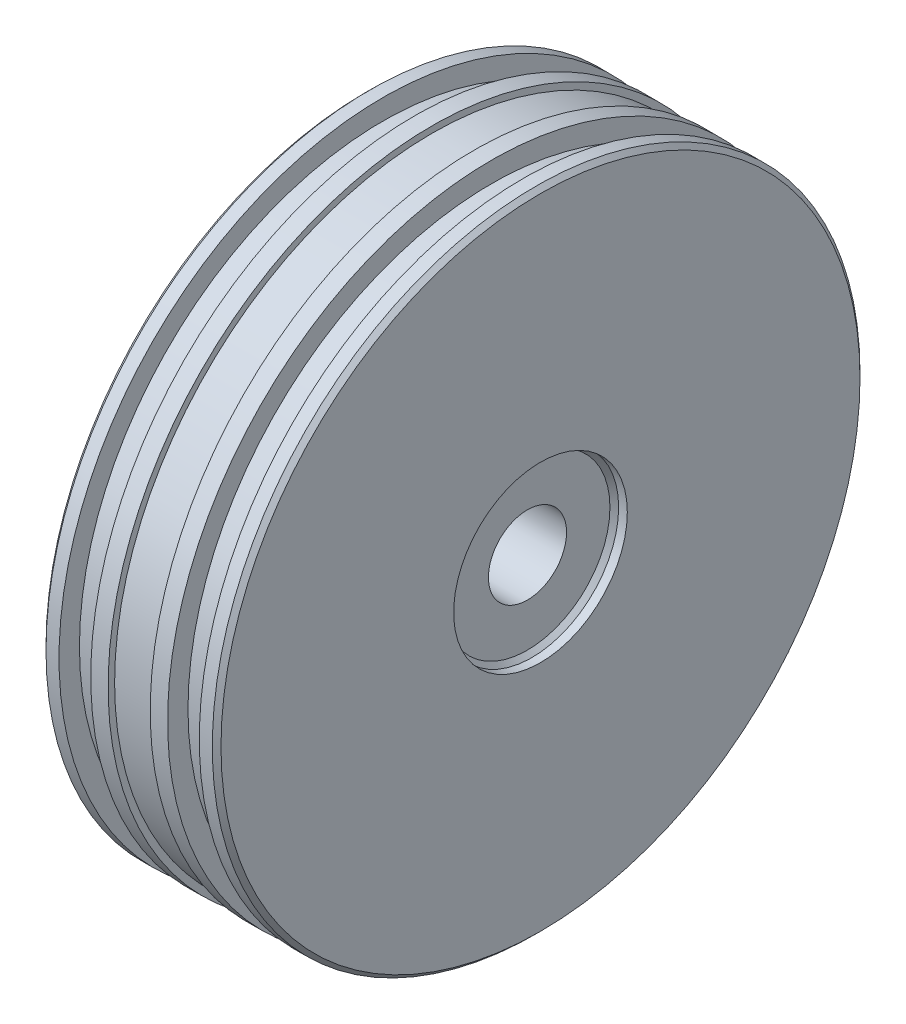
ISO-10303-21;
HEADER;
FILE_DESCRIPTION(('STEP AP214'),'2;1');
FILE_NAME('part.step','',(''),(''),'','','');
FILE_SCHEMA(('AUTOMOTIVE_DESIGN { 1 0 10303 214 1 1 1 1 }'));
ENDSEC;
DATA;
#1=APPLICATION_CONTEXT('core data for automotive mechanical design processes');
#2=APPLICATION_PROTOCOL_DEFINITION('international standard','automotive_design',2000,#1);
#3=PRODUCT_CONTEXT('',#1,'mechanical');
#4=PRODUCT('Part','Part','',(#3));
#5=PRODUCT_RELATED_PRODUCT_CATEGORY('part','',(#4));
#6=PRODUCT_DEFINITION_FORMATION('','',#4);
#7=PRODUCT_DEFINITION_CONTEXT('part definition',#1,'design');
#8=PRODUCT_DEFINITION('design','',#6,#7);
#9=PRODUCT_DEFINITION_SHAPE('','',#8);
#10=(LENGTH_UNIT() NAMED_UNIT(*) SI_UNIT(.MILLI.,.METRE.));
#11=(NAMED_UNIT(*) PLANE_ANGLE_UNIT() SI_UNIT($,.RADIAN.));
#12=(NAMED_UNIT(*) SI_UNIT($,.STERADIAN.) SOLID_ANGLE_UNIT());
#13=UNCERTAINTY_MEASURE_WITH_UNIT(LENGTH_MEASURE(1.E-05),#10,'distance_accuracy_value','');
#14=(GEOMETRIC_REPRESENTATION_CONTEXT(3) GLOBAL_UNCERTAINTY_ASSIGNED_CONTEXT((#13)) GLOBAL_UNIT_ASSIGNED_CONTEXT((#10,
#11,#12)) REPRESENTATION_CONTEXT('',''));
#15=CARTESIAN_POINT('',(0.,0.,0.));
#16=DIRECTION('',(0.,0.,1.));
#17=DIRECTION('',(1.,0.,0.));
#18=AXIS2_PLACEMENT_3D('',#15,#16,#17);
#19=CARTESIAN_POINT('',(0.,0.,0.));
#20=DIRECTION('',(1.,0.,0.));
#21=DIRECTION('',(0.,0.,-1.));
#22=AXIS2_PLACEMENT_3D('',#19,#20,#21);
#23=CYLINDRICAL_SURFACE('',#22,74.59);
#24=CARTESIAN_POINT('',(1.00000000000001,0.,0.));
#25=DIRECTION('',(-1.,0.,0.));
#26=DIRECTION('',(0.,0.,1.));
#27=AXIS2_PLACEMENT_3D('',#24,#25,#26);
#28=CIRCLE('',#27,74.59);
#29=CARTESIAN_POINT('',(1.00000000000001,0.,74.59));
#30=VERTEX_POINT('',#29);
#31=EDGE_CURVE('E250',#30,#30,#28,.F.);
#32=ORIENTED_EDGE('',*,*,#31,.T.);
#33=EDGE_LOOP('',(#32));
#34=FACE_BOUND('',#33,.T.);
#35=CARTESIAN_POINT('',(4.,0.,0.));
#36=DIRECTION('',(1.,0.,0.));
#37=DIRECTION('',(0.,0.,-1.));
#38=AXIS2_PLACEMENT_3D('',#35,#36,#37);
#39=CIRCLE('',#38,74.59);
#40=CARTESIAN_POINT('',(4.,0.,-74.59));
#41=VERTEX_POINT('',#40);
#42=EDGE_CURVE('E339',#41,#41,#39,.T.);
#43=ORIENTED_EDGE('',*,*,#42,.F.);
#44=EDGE_LOOP('',(#43));
#45=FACE_BOUND('',#44,.T.);
#46=ADVANCED_FACE('F43',(#34,#45),#23,.T.);
#47=CARTESIAN_POINT('',(0.,20.,0.));
#48=DIRECTION('',(-1.,0.,0.));
#49=DIRECTION('',(0.,0.,1.));
#50=AXIS2_PLACEMENT_3D('',#47,#48,#49);
#51=PLANE('',#50);
#52=CARTESIAN_POINT('',(0.,0.,0.));
#53=DIRECTION('',(-1.,0.,0.));
#54=DIRECTION('',(0.,0.,1.));
#55=AXIS2_PLACEMENT_3D('',#52,#53,#54);
#56=CIRCLE('',#55,21.);
#57=CARTESIAN_POINT('',(0.,0.,21.));
#58=VERTEX_POINT('',#57);
#59=EDGE_CURVE('E65',#58,#58,#56,.F.);
#60=ORIENTED_EDGE('',*,*,#59,.T.);
#61=EDGE_LOOP('',(#60));
#62=FACE_BOUND('',#61,.T.);
#63=CARTESIAN_POINT('',(0.,0.,0.));
#64=DIRECTION('',(-1.,0.,0.));
#65=DIRECTION('',(0.,0.,1.));
#66=AXIS2_PLACEMENT_3D('',#63,#64,#65);
#67=CIRCLE('',#66,73.59);
#68=CARTESIAN_POINT('',(0.,0.,73.59));
#69=VERTEX_POINT('',#68);
#70=EDGE_CURVE('E245',#69,#69,#67,.T.);
#71=ORIENTED_EDGE('',*,*,#70,.T.);
#72=EDGE_LOOP('',(#71));
#73=FACE_BOUND('',#72,.T.);
#74=ADVANCED_FACE('F112',(#62,#73),#51,.T.);
#75=CARTESIAN_POINT('',(0.,0.,0.));
#76=DIRECTION('',(1.,0.,0.));
#77=DIRECTION('',(0.,0.,-1.));
#78=AXIS2_PLACEMENT_3D('',#75,#76,#77);
#79=CYLINDRICAL_SURFACE('',#78,20.);
#80=CARTESIAN_POINT('',(1.,0.,0.));
#81=DIRECTION('',(-1.,0.,0.));
#82=DIRECTION('',(0.,0.,1.));
#83=AXIS2_PLACEMENT_3D('',#80,#81,#82);
#84=CIRCLE('',#83,20.);
#85=CARTESIAN_POINT('',(1.,0.,20.));
#86=VERTEX_POINT('',#85);
#87=EDGE_CURVE('E59',#86,#86,#84,.T.);
#88=ORIENTED_EDGE('',*,*,#87,.T.);
#89=EDGE_LOOP('',(#88));
#90=FACE_BOUND('',#89,.T.);
#91=CARTESIAN_POINT('',(12.,0.,0.));
#92=DIRECTION('',(-1.,0.,0.));
#93=DIRECTION('',(0.,0.,1.));
#94=AXIS2_PLACEMENT_3D('',#91,#92,#93);
#95=CIRCLE('',#94,20.);
#96=CARTESIAN_POINT('',(12.,0.,20.));
#97=VERTEX_POINT('',#96);
#98=EDGE_CURVE('E104',#97,#97,#95,.F.);
#99=ORIENTED_EDGE('',*,*,#98,.T.);
#100=EDGE_LOOP('',(#99));
#101=FACE_BOUND('',#100,.T.);
#102=ADVANCED_FACE('F135',(#90,#101),#79,.F.);
#103=CARTESIAN_POINT('',(15.,20.,0.));
#104=DIRECTION('',(-1.,0.,0.));
#105=DIRECTION('',(0.,0.,1.));
#106=AXIS2_PLACEMENT_3D('',#103,#104,#105);
#107=PLANE('',#106);
#108=CARTESIAN_POINT('',(15.,0.,0.));
#109=DIRECTION('',(-1.,0.,0.));
#110=DIRECTION('',(0.,0.,1.));
#111=AXIS2_PLACEMENT_3D('',#108,#109,#110);
#112=CIRCLE('',#111,17.);
#113=CARTESIAN_POINT('',(15.,0.,17.));
#114=VERTEX_POINT('',#113);
#115=EDGE_CURVE('E99',#114,#114,#112,.T.);
#116=ORIENTED_EDGE('',*,*,#115,.T.);
#117=EDGE_LOOP('',(#116));
#118=FACE_BOUND('',#117,.T.);
#119=CARTESIAN_POINT('',(15.,0.,0.));
#120=DIRECTION('',(1.,0.,0.));
#121=DIRECTION('',(0.,0.,-1.));
#122=AXIS2_PLACEMENT_3D('',#119,#120,#121);
#123=CIRCLE('',#122,9.);
#124=CARTESIAN_POINT('',(15.,0.,-9.));
#125=VERTEX_POINT('',#124);
#126=EDGE_CURVE('E84',#125,#125,#123,.T.);
#127=ORIENTED_EDGE('',*,*,#126,.T.);
#128=EDGE_LOOP('',(#127));
#129=FACE_BOUND('',#128,.T.);
#130=ADVANCED_FACE('F232',(#118,#129),#107,.T.);
#131=CARTESIAN_POINT('',(0.,0.,0.));
#132=DIRECTION('',(1.,0.,0.));
#133=DIRECTION('',(0.,0.,-1.));
#134=AXIS2_PLACEMENT_3D('',#131,#132,#133);
#135=CYLINDRICAL_SURFACE('',#134,9.);
#136=CARTESIAN_POINT('',(37.3,0.,0.));
#137=DIRECTION('',(1.,0.,0.));
#138=DIRECTION('',(0.,0.,-1.));
#139=AXIS2_PLACEMENT_3D('',#136,#137,#138);
#140=CIRCLE('',#139,9.);
#141=CARTESIAN_POINT('',(37.3,0.,-9.));
#142=VERTEX_POINT('',#141);
#143=EDGE_CURVE('E79',#142,#142,#140,.T.);
#144=ORIENTED_EDGE('',*,*,#143,.T.);
#145=EDGE_LOOP('',(#144));
#146=FACE_BOUND('',#145,.T.);
#147=ORIENTED_EDGE('',*,*,#126,.F.);
#148=EDGE_LOOP('',(#147));
#149=FACE_BOUND('',#148,.T.);
#150=ADVANCED_FACE('F229',(#146,#149),#135,.F.);
#151=CARTESIAN_POINT('',(37.3,9.,0.));
#152=DIRECTION('',(1.,0.,0.));
#153=DIRECTION('',(0.,0.,-1.));
#154=AXIS2_PLACEMENT_3D('',#151,#152,#153);
#155=PLANE('',#154);
#156=CARTESIAN_POINT('',(37.3,0.,0.));
#157=DIRECTION('',(1.,0.,0.));
#158=DIRECTION('',(0.,0.,-1.));
#159=AXIS2_PLACEMENT_3D('',#156,#157,#158);
#160=CIRCLE('',#159,19.);
#161=CARTESIAN_POINT('',(37.3,0.,-19.));
#162=VERTEX_POINT('',#161);
#163=EDGE_CURVE('E52',#162,#162,#160,.T.);
#164=ORIENTED_EDGE('',*,*,#163,.T.);
#165=EDGE_LOOP('',(#164));
#166=FACE_BOUND('',#165,.T.);
#167=ORIENTED_EDGE('',*,*,#143,.F.);
#168=EDGE_LOOP('',(#167));
#169=FACE_BOUND('',#168,.T.);
#170=ADVANCED_FACE('F226',(#166,#169),#155,.T.);
#171=CARTESIAN_POINT('',(0.,0.,0.));
#172=DIRECTION('',(1.,0.,0.));
#173=DIRECTION('',(0.,0.,-1.));
#174=AXIS2_PLACEMENT_3D('',#171,#172,#173);
#175=CYLINDRICAL_SURFACE('',#174,20.);
#176=CARTESIAN_POINT('',(38.3,0.,0.));
#177=DIRECTION('',(1.,0.,0.));
#178=DIRECTION('',(0.,0.,-1.));
#179=AXIS2_PLACEMENT_3D('',#176,#177,#178);
#180=CIRCLE('',#179,20.);
#181=CARTESIAN_POINT('',(38.3,0.,-20.));
#182=VERTEX_POINT('',#181);
#183=EDGE_CURVE('E11',#182,#182,#180,.F.);
#184=ORIENTED_EDGE('',*,*,#183,.T.);
#185=EDGE_LOOP('',(#184));
#186=FACE_BOUND('',#185,.T.);
#187=CARTESIAN_POINT('',(40.3,0.,0.));
#188=DIRECTION('',(1.,0.,0.));
#189=DIRECTION('',(0.,0.,-1.));
#190=AXIS2_PLACEMENT_3D('',#187,#188,#189);
#191=CIRCLE('',#190,20.);
#192=CARTESIAN_POINT('',(40.3,0.,-20.));
#193=VERTEX_POINT('',#192);
#194=EDGE_CURVE('E85',#193,#193,#191,.T.);
#195=ORIENTED_EDGE('',*,*,#194,.T.);
#196=EDGE_LOOP('',(#195));
#197=FACE_BOUND('',#196,.T.);
#198=ADVANCED_FACE('F220',(#186,#197),#175,.F.);
#199=CARTESIAN_POINT('',(40.3,74.59,0.));
#200=DIRECTION('',(1.,0.,0.));
#201=DIRECTION('',(0.,0.,-1.));
#202=AXIS2_PLACEMENT_3D('',#199,#200,#201);
#203=PLANE('',#202);
#204=CARTESIAN_POINT('',(40.3,0.,0.));
#205=DIRECTION('',(1.,0.,0.));
#206=DIRECTION('',(0.,0.,-1.));
#207=AXIS2_PLACEMENT_3D('',#204,#205,#206);
#208=CIRCLE('',#207,73.5900000000001);
#209=CARTESIAN_POINT('',(40.3,0.,-73.5900000000001));
#210=VERTEX_POINT('',#209);
#211=EDGE_CURVE('E91',#210,#210,#208,.T.);
#212=ORIENTED_EDGE('',*,*,#211,.T.);
#213=EDGE_LOOP('',(#212));
#214=FACE_BOUND('',#213,.T.);
#215=ORIENTED_EDGE('',*,*,#194,.F.);
#216=EDGE_LOOP('',(#215));
#217=FACE_BOUND('',#216,.T.);
#218=ADVANCED_FACE('F215',(#214,#217),#203,.T.);
#219=CARTESIAN_POINT('',(0.,0.,0.));
#220=DIRECTION('',(1.,0.,0.));
#221=DIRECTION('',(0.,0.,-1.));
#222=AXIS2_PLACEMENT_3D('',#219,#220,#221);
#223=CYLINDRICAL_SURFACE('',#222,74.59);
#224=CARTESIAN_POINT('',(39.3000000000001,0.,0.));
#225=DIRECTION('',(1.,0.,0.));
#226=DIRECTION('',(0.,0.,-1.));
#227=AXIS2_PLACEMENT_3D('',#224,#225,#226);
#228=CIRCLE('',#227,74.59);
#229=CARTESIAN_POINT('',(39.3000000000001,0.,-74.59));
#230=VERTEX_POINT('',#229);
#231=EDGE_CURVE('E254',#230,#230,#228,.F.);
#232=ORIENTED_EDGE('',*,*,#231,.T.);
#233=EDGE_LOOP('',(#232));
#234=FACE_BOUND('',#233,.T.);
#235=CARTESIAN_POINT('',(36.3,0.,0.));
#236=DIRECTION('',(1.,0.,0.));
#237=DIRECTION('',(0.,0.,-1.));
#238=AXIS2_PLACEMENT_3D('',#235,#236,#237);
#239=CIRCLE('',#238,74.59);
#240=CARTESIAN_POINT('',(36.3,0.,-74.59));
#241=VERTEX_POINT('',#240);
#242=EDGE_CURVE('E272',#241,#241,#239,.T.);
#243=ORIENTED_EDGE('',*,*,#242,.T.);
#244=EDGE_LOOP('',(#243));
#245=FACE_BOUND('',#244,.T.);
#246=ADVANCED_FACE('F211',(#234,#245),#223,.T.);
#247=CARTESIAN_POINT('',(36.3,69.89,0.));
#248=DIRECTION('',(-1.,0.,0.));
#249=DIRECTION('',(0.,0.,1.));
#250=AXIS2_PLACEMENT_3D('',#247,#248,#249);
#251=PLANE('',#250);
#252=CARTESIAN_POINT('',(36.3,0.,0.));
#253=DIRECTION('',(1.,0.,0.));
#254=DIRECTION('',(0.,0.,-1.));
#255=AXIS2_PLACEMENT_3D('',#252,#253,#254);
#256=CIRCLE('',#255,69.89);
#257=CARTESIAN_POINT('',(36.3,0.,-69.89));
#258=VERTEX_POINT('',#257);
#259=EDGE_CURVE('E274',#258,#258,#256,.T.);
#260=ORIENTED_EDGE('',*,*,#259,.T.);
#261=EDGE_LOOP('',(#260));
#262=FACE_BOUND('',#261,.T.);
#263=ORIENTED_EDGE('',*,*,#242,.F.);
#264=EDGE_LOOP('',(#263));
#265=FACE_BOUND('',#264,.T.);
#266=ADVANCED_FACE('F206',(#262,#265),#251,.T.);
#267=CARTESIAN_POINT('',(0.,0.,0.));
#268=DIRECTION('',(1.,0.,0.));
#269=DIRECTION('',(0.,0.,-1.));
#270=AXIS2_PLACEMENT_3D('',#267,#268,#269);
#271=CYLINDRICAL_SURFACE('',#270,69.89);
#272=CARTESIAN_POINT('',(29.,0.,0.));
#273=DIRECTION('',(1.,0.,0.));
#274=DIRECTION('',(0.,0.,-1.));
#275=AXIS2_PLACEMENT_3D('',#272,#273,#274);
#276=CIRCLE('',#275,69.89);
#277=CARTESIAN_POINT('',(29.,0.,-69.89));
#278=VERTEX_POINT('',#277);
#279=EDGE_CURVE('E278',#278,#278,#276,.T.);
#280=ORIENTED_EDGE('',*,*,#279,.T.);
#281=EDGE_LOOP('',(#280));
#282=FACE_BOUND('',#281,.T.);
#283=ORIENTED_EDGE('',*,*,#259,.F.);
#284=EDGE_LOOP('',(#283));
#285=FACE_BOUND('',#284,.T.);
#286=ADVANCED_FACE('F200',(#282,#285),#271,.T.);
#287=CARTESIAN_POINT('',(29.,74.59,0.));
#288=DIRECTION('',(1.,0.,0.));
#289=DIRECTION('',(0.,0.,-1.));
#290=AXIS2_PLACEMENT_3D('',#287,#288,#289);
#291=PLANE('',#290);
#292=CARTESIAN_POINT('',(29.,0.,0.));
#293=DIRECTION('',(1.,0.,0.));
#294=DIRECTION('',(0.,0.,-1.));
#295=AXIS2_PLACEMENT_3D('',#292,#293,#294);
#296=CIRCLE('',#295,74.59);
#297=CARTESIAN_POINT('',(29.,0.,-74.59));
#298=VERTEX_POINT('',#297);
#299=EDGE_CURVE('E290',#298,#298,#296,.T.);
#300=ORIENTED_EDGE('',*,*,#299,.T.);
#301=EDGE_LOOP('',(#300));
#302=FACE_BOUND('',#301,.T.);
#303=ORIENTED_EDGE('',*,*,#279,.F.);
#304=EDGE_LOOP('',(#303));
#305=FACE_BOUND('',#304,.T.);
#306=ADVANCED_FACE('F195',(#302,#305),#291,.T.);
#307=CARTESIAN_POINT('',(0.,0.,0.));
#308=DIRECTION('',(1.,0.,0.));
#309=DIRECTION('',(0.,0.,-1.));
#310=AXIS2_PLACEMENT_3D('',#307,#308,#309);
#311=CYLINDRICAL_SURFACE('',#310,74.59);
#312=CARTESIAN_POINT('',(25.,0.,0.));
#313=DIRECTION('',(1.,0.,0.));
#314=DIRECTION('',(0.,0.,-1.));
#315=AXIS2_PLACEMENT_3D('',#312,#313,#314);
#316=CIRCLE('',#315,74.59);
#317=CARTESIAN_POINT('',(25.,0.,-74.59));
#318=VERTEX_POINT('',#317);
#319=EDGE_CURVE('E294',#318,#318,#316,.T.);
#320=ORIENTED_EDGE('',*,*,#319,.T.);
#321=EDGE_LOOP('',(#320));
#322=FACE_BOUND('',#321,.T.);
#323=ORIENTED_EDGE('',*,*,#299,.F.);
#324=EDGE_LOOP('',(#323));
#325=FACE_BOUND('',#324,.T.);
#326=ADVANCED_FACE('F191',(#322,#325),#311,.T.);
#327=CARTESIAN_POINT('',(25.,73.09,0.));
#328=DIRECTION('',(-1.,0.,0.));
#329=DIRECTION('',(0.,0.,1.));
#330=AXIS2_PLACEMENT_3D('',#327,#328,#329);
#331=PLANE('',#330);
#332=CARTESIAN_POINT('',(25.,0.,0.));
#333=DIRECTION('',(1.,0.,0.));
#334=DIRECTION('',(0.,0.,-1.));
#335=AXIS2_PLACEMENT_3D('',#332,#333,#334);
#336=CIRCLE('',#335,73.09);
#337=CARTESIAN_POINT('',(25.,0.,-73.09));
#338=VERTEX_POINT('',#337);
#339=EDGE_CURVE('E298',#338,#338,#336,.T.);
#340=ORIENTED_EDGE('',*,*,#339,.T.);
#341=EDGE_LOOP('',(#340));
#342=FACE_BOUND('',#341,.T.);
#343=ORIENTED_EDGE('',*,*,#319,.F.);
#344=EDGE_LOOP('',(#343));
#345=FACE_BOUND('',#344,.T.);
#346=ADVANCED_FACE('F187',(#342,#345),#331,.T.);
#347=CARTESIAN_POINT('',(0.,0.,0.));
#348=DIRECTION('',(1.,0.,0.));
#349=DIRECTION('',(0.,0.,-1.));
#350=AXIS2_PLACEMENT_3D('',#347,#348,#349);
#351=CYLINDRICAL_SURFACE('',#350,73.09);
#352=CARTESIAN_POINT('',(15.3,0.,0.));
#353=DIRECTION('',(1.,0.,0.));
#354=DIRECTION('',(0.,0.,-1.));
#355=AXIS2_PLACEMENT_3D('',#352,#353,#354);
#356=CIRCLE('',#355,73.09);
#357=CARTESIAN_POINT('',(15.3,0.,-73.09));
#358=VERTEX_POINT('',#357);
#359=EDGE_CURVE('E311',#358,#358,#356,.T.);
#360=ORIENTED_EDGE('',*,*,#359,.T.);
#361=EDGE_LOOP('',(#360));
#362=FACE_BOUND('',#361,.T.);
#363=ORIENTED_EDGE('',*,*,#339,.F.);
#364=EDGE_LOOP('',(#363));
#365=FACE_BOUND('',#364,.T.);
#366=ADVANCED_FACE('F180',(#362,#365),#351,.T.);
#367=CARTESIAN_POINT('',(15.3,74.59,0.));
#368=DIRECTION('',(1.,0.,0.));
#369=DIRECTION('',(0.,0.,-1.));
#370=AXIS2_PLACEMENT_3D('',#367,#368,#369);
#371=PLANE('',#370);
#372=CARTESIAN_POINT('',(15.3,0.,0.));
#373=DIRECTION('',(1.,0.,0.));
#374=DIRECTION('',(0.,0.,-1.));
#375=AXIS2_PLACEMENT_3D('',#372,#373,#374);
#376=CIRCLE('',#375,74.59);
#377=CARTESIAN_POINT('',(15.3,0.,-74.59));
#378=VERTEX_POINT('',#377);
#379=EDGE_CURVE('E307',#378,#378,#376,.T.);
#380=ORIENTED_EDGE('',*,*,#379,.T.);
#381=EDGE_LOOP('',(#380));
#382=FACE_BOUND('',#381,.T.);
#383=ORIENTED_EDGE('',*,*,#359,.F.);
#384=EDGE_LOOP('',(#383));
#385=FACE_BOUND('',#384,.T.);
#386=ADVANCED_FACE('F175',(#382,#385),#371,.T.);
#387=CARTESIAN_POINT('',(0.,0.,0.));
#388=DIRECTION('',(1.,0.,0.));
#389=DIRECTION('',(0.,0.,-1.));
#390=AXIS2_PLACEMENT_3D('',#387,#388,#389);
#391=CYLINDRICAL_SURFACE('',#390,74.59);
#392=CARTESIAN_POINT('',(11.3,0.,0.));
#393=DIRECTION('',(1.,0.,0.));
#394=DIRECTION('',(0.,0.,-1.));
#395=AXIS2_PLACEMENT_3D('',#392,#393,#394);
#396=CIRCLE('',#395,74.59);
#397=CARTESIAN_POINT('',(11.3,0.,-74.59));
#398=VERTEX_POINT('',#397);
#399=EDGE_CURVE('E312',#398,#398,#396,.T.);
#400=ORIENTED_EDGE('',*,*,#399,.T.);
#401=EDGE_LOOP('',(#400));
#402=FACE_BOUND('',#401,.T.);
#403=ORIENTED_EDGE('',*,*,#379,.F.);
#404=EDGE_LOOP('',(#403));
#405=FACE_BOUND('',#404,.T.);
#406=ADVANCED_FACE('F171',(#402,#405),#391,.T.);
#407=CARTESIAN_POINT('',(11.3,69.89,0.));
#408=DIRECTION('',(-1.,0.,0.));
#409=DIRECTION('',(0.,0.,1.));
#410=AXIS2_PLACEMENT_3D('',#407,#408,#409);
#411=PLANE('',#410);
#412=CARTESIAN_POINT('',(11.3,0.,0.));
#413=DIRECTION('',(1.,0.,0.));
#414=DIRECTION('',(0.,0.,-1.));
#415=AXIS2_PLACEMENT_3D('',#412,#413,#414);
#416=CIRCLE('',#415,69.89);
#417=CARTESIAN_POINT('',(11.3,0.,-69.89));
#418=VERTEX_POINT('',#417);
#419=EDGE_CURVE('E333',#418,#418,#416,.T.);
#420=ORIENTED_EDGE('',*,*,#419,.T.);
#421=EDGE_LOOP('',(#420));
#422=FACE_BOUND('',#421,.T.);
#423=ORIENTED_EDGE('',*,*,#399,.F.);
#424=EDGE_LOOP('',(#423));
#425=FACE_BOUND('',#424,.T.);
#426=ADVANCED_FACE('F166',(#422,#425),#411,.T.);
#427=CARTESIAN_POINT('',(0.,0.,0.));
#428=DIRECTION('',(1.,0.,0.));
#429=DIRECTION('',(0.,0.,-1.));
#430=AXIS2_PLACEMENT_3D('',#427,#428,#429);
#431=CYLINDRICAL_SURFACE('',#430,69.89);
#432=CARTESIAN_POINT('',(4.,0.,0.));
#433=DIRECTION('',(1.,0.,0.));
#434=DIRECTION('',(0.,0.,-1.));
#435=AXIS2_PLACEMENT_3D('',#432,#433,#434);
#436=CIRCLE('',#435,69.89);
#437=CARTESIAN_POINT('',(4.,0.,-69.89));
#438=VERTEX_POINT('',#437);
#439=EDGE_CURVE('E336',#438,#438,#436,.T.);
#440=ORIENTED_EDGE('',*,*,#439,.T.);
#441=EDGE_LOOP('',(#440));
#442=FACE_BOUND('',#441,.T.);
#443=ORIENTED_EDGE('',*,*,#419,.F.);
#444=EDGE_LOOP('',(#443));
#445=FACE_BOUND('',#444,.T.);
#446=ADVANCED_FACE('F160',(#442,#445),#431,.T.);
#447=CARTESIAN_POINT('',(4.,74.59,0.));
#448=DIRECTION('',(1.,0.,0.));
#449=DIRECTION('',(0.,0.,-1.));
#450=AXIS2_PLACEMENT_3D('',#447,#448,#449);
#451=PLANE('',#450);
#452=ORIENTED_EDGE('',*,*,#42,.T.);
#453=EDGE_LOOP('',(#452));
#454=FACE_BOUND('',#453,.T.);
#455=ORIENTED_EDGE('',*,*,#439,.F.);
#456=EDGE_LOOP('',(#455));
#457=FACE_BOUND('',#456,.T.);
#458=ADVANCED_FACE('F151',(#454,#457),#451,.T.);
#459=CARTESIAN_POINT('',(40.3,0.,0.));
#460=DIRECTION('',(-1.,0.,0.));
#461=DIRECTION('',(0.,0.,1.));
#462=AXIS2_PLACEMENT_3D('',#459,#460,#461);
#463=CONICAL_SURFACE('',#462,73.5900000000001,0.785398163397448);
#464=ORIENTED_EDGE('',*,*,#231,.F.);
#465=EDGE_LOOP('',(#464));
#466=FACE_BOUND('',#465,.T.);
#467=ORIENTED_EDGE('',*,*,#211,.F.);
#468=EDGE_LOOP('',(#467));
#469=FACE_BOUND('',#468,.T.);
#470=ADVANCED_FACE('F146',(#466,#469),#463,.T.);
#471=CARTESIAN_POINT('',(1.00000000000001,0.,0.));
#472=DIRECTION('',(1.,0.,0.));
#473=DIRECTION('',(0.,0.,-1.));
#474=AXIS2_PLACEMENT_3D('',#471,#472,#473);
#475=CONICAL_SURFACE('',#474,74.59,0.785398163397448);
#476=ORIENTED_EDGE('',*,*,#70,.F.);
#477=EDGE_LOOP('',(#476));
#478=FACE_BOUND('',#477,.T.);
#479=ORIENTED_EDGE('',*,*,#31,.F.);
#480=EDGE_LOOP('',(#479));
#481=FACE_BOUND('',#480,.T.);
#482=ADVANCED_FACE('F124',(#478,#481),#475,.T.);
#483=CARTESIAN_POINT('',(12.,0.,0.));
#484=DIRECTION('',(-1.,0.,0.));
#485=DIRECTION('',(0.,0.,1.));
#486=AXIS2_PLACEMENT_3D('',#483,#484,#485);
#487=CONICAL_SURFACE('',#486,20.,0.785398163397441);
#488=ORIENTED_EDGE('',*,*,#115,.F.);
#489=EDGE_LOOP('',(#488));
#490=FACE_BOUND('',#489,.T.);
#491=ORIENTED_EDGE('',*,*,#98,.F.);
#492=EDGE_LOOP('',(#491));
#493=FACE_BOUND('',#492,.T.);
#494=ADVANCED_FACE('F117',(#490,#493),#487,.F.);
#495=CARTESIAN_POINT('',(0.,0.,0.));
#496=DIRECTION('',(-1.,0.,0.));
#497=DIRECTION('',(0.,0.,1.));
#498=AXIS2_PLACEMENT_3D('',#495,#496,#497);
#499=CONICAL_SURFACE('',#498,21.,0.785398163397441);
#500=ORIENTED_EDGE('',*,*,#87,.F.);
#501=EDGE_LOOP('',(#500));
#502=FACE_BOUND('',#501,.T.);
#503=ORIENTED_EDGE('',*,*,#59,.F.);
#504=EDGE_LOOP('',(#503));
#505=FACE_BOUND('',#504,.T.);
#506=ADVANCED_FACE('F115',(#502,#505),#499,.F.);
#507=CARTESIAN_POINT('',(37.3,0.,0.));
#508=DIRECTION('',(1.,0.,0.));
#509=DIRECTION('',(0.,0.,-1.));
#510=AXIS2_PLACEMENT_3D('',#507,#508,#509);
#511=CONICAL_SURFACE('',#510,19.,0.785398163397454);
#512=ORIENTED_EDGE('',*,*,#183,.F.);
#513=EDGE_LOOP('',(#512));
#514=FACE_BOUND('',#513,.T.);
#515=ORIENTED_EDGE('',*,*,#163,.F.);
#516=EDGE_LOOP('',(#515));
#517=FACE_BOUND('',#516,.T.);
#518=ADVANCED_FACE('F46',(#514,#517),#511,.F.);
#519=CLOSED_SHELL('',(#46,#74,#102,#130,#150,#170,#198,#218,#246,#266,#286,#306,#326,#346,#366,
#386,#406,#426,#446,#458,#470,#482,#494,#506,#518));
#520=MANIFOLD_SOLID_BREP('B2',#519);
#521=ADVANCED_BREP_SHAPE_REPRESENTATION('',(#18,#520),#14);
#522=SHAPE_DEFINITION_REPRESENTATION(#9,#521);
ENDSEC;
END-ISO-10303-21;
